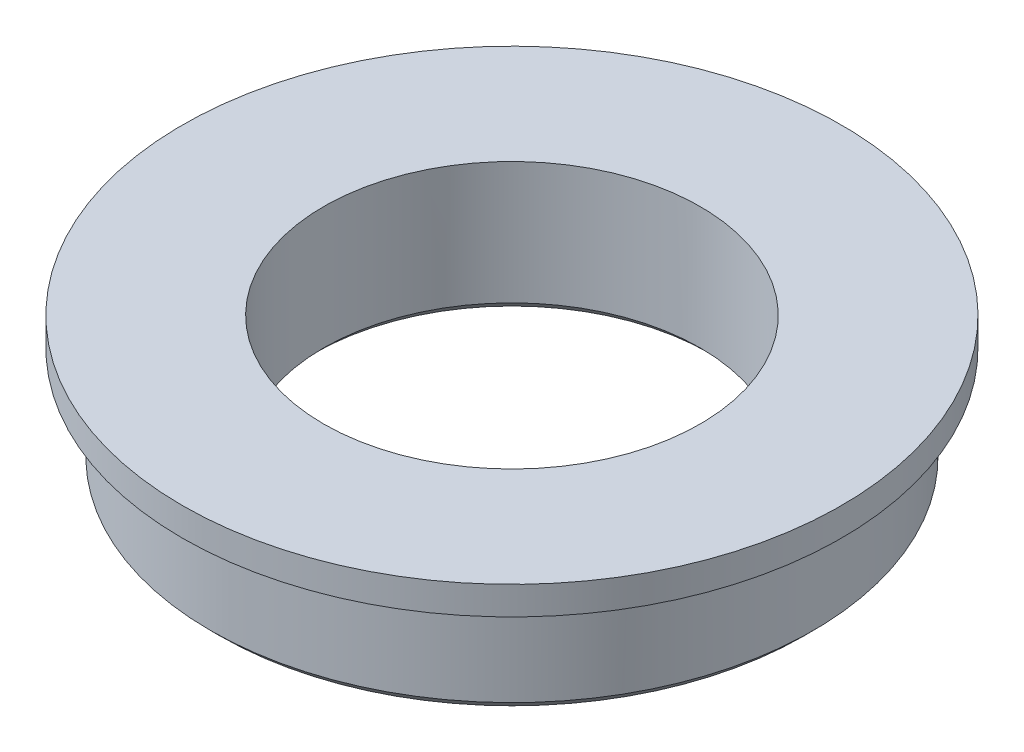
ISO-10303-21;
HEADER;
FILE_DESCRIPTION(('STEP AP214'),'2;1');
FILE_NAME('part.step','',(''),(''),'','','');
FILE_SCHEMA(('AUTOMOTIVE_DESIGN { 1 0 10303 214 1 1 1 1 }'));
ENDSEC;
DATA;
#1=APPLICATION_CONTEXT('core data for automotive mechanical design processes');
#2=APPLICATION_PROTOCOL_DEFINITION('international standard','automotive_design',2000,#1);
#3=PRODUCT_CONTEXT('',#1,'mechanical');
#4=PRODUCT('Part','Part','',(#3));
#5=PRODUCT_RELATED_PRODUCT_CATEGORY('part','',(#4));
#6=PRODUCT_DEFINITION_FORMATION('','',#4);
#7=PRODUCT_DEFINITION_CONTEXT('part definition',#1,'design');
#8=PRODUCT_DEFINITION('design','',#6,#7);
#9=PRODUCT_DEFINITION_SHAPE('','',#8);
#10=(LENGTH_UNIT() NAMED_UNIT(*) SI_UNIT(.MILLI.,.METRE.));
#11=(NAMED_UNIT(*) PLANE_ANGLE_UNIT() SI_UNIT($,.RADIAN.));
#12=(NAMED_UNIT(*) SI_UNIT($,.STERADIAN.) SOLID_ANGLE_UNIT());
#13=UNCERTAINTY_MEASURE_WITH_UNIT(LENGTH_MEASURE(1.E-05),#10,'distance_accuracy_value','');
#14=(GEOMETRIC_REPRESENTATION_CONTEXT(3) GLOBAL_UNCERTAINTY_ASSIGNED_CONTEXT((#13)) GLOBAL_UNIT_ASSIGNED_CONTEXT((#10,
#11,#12)) REPRESENTATION_CONTEXT('',''));
#15=CARTESIAN_POINT('',(0.,0.,0.));
#16=DIRECTION('',(0.,0.,1.));
#17=DIRECTION('',(1.,0.,0.));
#18=AXIS2_PLACEMENT_3D('',#15,#16,#17);
#19=CARTESIAN_POINT('',(-16.,0.,0.));
#20=DIRECTION('',(0.,-1.,0.));
#21=DIRECTION('',(0.,0.,-1.));
#22=AXIS2_PLACEMENT_3D('',#19,#20,#21);
#23=PLANE('',#22);
#24=CARTESIAN_POINT('',(0.,0.,0.));
#25=DIRECTION('',(0.,-1.,0.));
#26=DIRECTION('',(0.,0.,-1.));
#27=AXIS2_PLACEMENT_3D('',#24,#25,#26);
#28=CIRCLE('',#27,10.5);
#29=CARTESIAN_POINT('',(0.,0.,-10.5));
#30=VERTEX_POINT('',#29);
#31=EDGE_CURVE('E44',#30,#30,#28,.F.);
#32=ORIENTED_EDGE('',*,*,#31,.T.);
#33=EDGE_LOOP('',(#32));
#34=FACE_BOUND('',#33,.T.);
#35=CARTESIAN_POINT('',(0.,0.,0.));
#36=DIRECTION('',(0.,-1.,0.));
#37=DIRECTION('',(0.,0.,-1.));
#38=AXIS2_PLACEMENT_3D('',#35,#36,#37);
#39=CIRCLE('',#38,15.5);
#40=CARTESIAN_POINT('',(0.,0.,-15.5));
#41=VERTEX_POINT('',#40);
#42=EDGE_CURVE('E48',#41,#41,#39,.T.);
#43=ORIENTED_EDGE('',*,*,#42,.T.);
#44=EDGE_LOOP('',(#43));
#45=FACE_BOUND('',#44,.T.);
#46=ADVANCED_FACE('F33',(#34,#45),#23,.T.);
#47=CARTESIAN_POINT('',(0.,90.7071628576238,0.));
#48=DIRECTION('',(0.,1.,0.));
#49=DIRECTION('',(0.,0.,1.));
#50=AXIS2_PLACEMENT_3D('',#47,#48,#49);
#51=CYLINDRICAL_SURFACE('',#50,9.99999999999999);
#52=CARTESIAN_POINT('',(0.,0.500000000000014,0.));
#53=DIRECTION('',(0.,-1.,0.));
#54=DIRECTION('',(0.,0.,-1.));
#55=AXIS2_PLACEMENT_3D('',#52,#53,#54);
#56=CIRCLE('',#55,9.99999999999999);
#57=CARTESIAN_POINT('',(0.,0.500000000000014,-9.99999999999999));
#58=VERTEX_POINT('',#57);
#59=EDGE_CURVE('E40',#58,#58,#56,.T.);
#60=ORIENTED_EDGE('',*,*,#59,.T.);
#61=EDGE_LOOP('',(#60));
#62=FACE_BOUND('',#61,.T.);
#63=CARTESIAN_POINT('',(0.,6.99999999999999,0.));
#64=DIRECTION('',(0.,1.,0.));
#65=DIRECTION('',(0.,0.,1.));
#66=AXIS2_PLACEMENT_3D('',#63,#64,#65);
#67=CIRCLE('',#66,9.99999999999999);
#68=CARTESIAN_POINT('',(0.,6.99999999999999,9.99999999999999));
#69=VERTEX_POINT('',#68);
#70=EDGE_CURVE('E53',#69,#69,#67,.T.);
#71=ORIENTED_EDGE('',*,*,#70,.T.);
#72=EDGE_LOOP('',(#71));
#73=FACE_BOUND('',#72,.T.);
#74=ADVANCED_FACE('F81',(#62,#73),#51,.F.);
#75=CARTESIAN_POINT('',(-9.99999999999999,7.,0.));
#76=DIRECTION('',(0.,1.,0.));
#77=DIRECTION('',(0.,0.,1.));
#78=AXIS2_PLACEMENT_3D('',#75,#76,#77);
#79=PLANE('',#78);
#80=CARTESIAN_POINT('',(0.,6.99999999999999,0.));
#81=DIRECTION('',(0.,1.,0.));
#82=DIRECTION('',(0.,0.,1.));
#83=AXIS2_PLACEMENT_3D('',#80,#81,#82);
#84=CIRCLE('',#83,17.5);
#85=CARTESIAN_POINT('',(0.,6.99999999999999,17.5));
#86=VERTEX_POINT('',#85);
#87=EDGE_CURVE('E56',#86,#86,#84,.T.);
#88=ORIENTED_EDGE('',*,*,#87,.T.);
#89=EDGE_LOOP('',(#88));
#90=FACE_BOUND('',#89,.T.);
#91=ORIENTED_EDGE('',*,*,#70,.F.);
#92=EDGE_LOOP('',(#91));
#93=FACE_BOUND('',#92,.T.);
#94=ADVANCED_FACE('F87',(#90,#93),#79,.T.);
#95=CARTESIAN_POINT('',(0.,90.7071628576238,0.));
#96=DIRECTION('',(0.,1.,0.));
#97=DIRECTION('',(0.,0.,1.));
#98=AXIS2_PLACEMENT_3D('',#95,#96,#97);
#99=CYLINDRICAL_SURFACE('',#98,17.5);
#100=CARTESIAN_POINT('',(0.,5.50000000000001,0.));
#101=DIRECTION('',(0.,1.,0.));
#102=DIRECTION('',(0.,0.,1.));
#103=AXIS2_PLACEMENT_3D('',#100,#101,#102);
#104=CIRCLE('',#103,17.5);
#105=CARTESIAN_POINT('',(0.,5.50000000000001,17.5));
#106=VERTEX_POINT('',#105);
#107=EDGE_CURVE('E59',#106,#106,#104,.T.);
#108=ORIENTED_EDGE('',*,*,#107,.T.);
#109=EDGE_LOOP('',(#108));
#110=FACE_BOUND('',#109,.T.);
#111=ORIENTED_EDGE('',*,*,#87,.F.);
#112=EDGE_LOOP('',(#111));
#113=FACE_BOUND('',#112,.T.);
#114=ADVANCED_FACE('F78',(#110,#113),#99,.T.);
#115=CARTESIAN_POINT('',(-17.5,5.5,0.));
#116=DIRECTION('',(0.,-1.,0.));
#117=DIRECTION('',(0.,0.,-1.));
#118=AXIS2_PLACEMENT_3D('',#115,#116,#117);
#119=PLANE('',#118);
#120=CARTESIAN_POINT('',(0.,5.50000000000001,0.));
#121=DIRECTION('',(0.,1.,0.));
#122=DIRECTION('',(0.,0.,1.));
#123=AXIS2_PLACEMENT_3D('',#120,#121,#122);
#124=CIRCLE('',#123,16.);
#125=CARTESIAN_POINT('',(0.,5.50000000000001,16.));
#126=VERTEX_POINT('',#125);
#127=EDGE_CURVE('E62',#126,#126,#124,.T.);
#128=ORIENTED_EDGE('',*,*,#127,.T.);
#129=EDGE_LOOP('',(#128));
#130=FACE_BOUND('',#129,.T.);
#131=ORIENTED_EDGE('',*,*,#107,.F.);
#132=EDGE_LOOP('',(#131));
#133=FACE_BOUND('',#132,.T.);
#134=ADVANCED_FACE('F66',(#130,#133),#119,.T.);
#135=CARTESIAN_POINT('',(0.,90.7071628576238,0.));
#136=DIRECTION('',(0.,1.,0.));
#137=DIRECTION('',(0.,0.,1.));
#138=AXIS2_PLACEMENT_3D('',#135,#136,#137);
#139=CYLINDRICAL_SURFACE('',#138,16.);
#140=CARTESIAN_POINT('',(0.,0.500000000000014,0.));
#141=DIRECTION('',(0.,-1.,0.));
#142=DIRECTION('',(0.,0.,-1.));
#143=AXIS2_PLACEMENT_3D('',#140,#141,#142);
#144=CIRCLE('',#143,16.);
#145=CARTESIAN_POINT('',(0.,0.500000000000014,-16.));
#146=VERTEX_POINT('',#145);
#147=EDGE_CURVE('E10',#146,#146,#144,.F.);
#148=ORIENTED_EDGE('',*,*,#147,.T.);
#149=EDGE_LOOP('',(#148));
#150=FACE_BOUND('',#149,.T.);
#151=ORIENTED_EDGE('',*,*,#127,.F.);
#152=EDGE_LOOP('',(#151));
#153=FACE_BOUND('',#152,.T.);
#154=ADVANCED_FACE('F69',(#150,#153),#139,.T.);
#155=CARTESIAN_POINT('',(0.,0.,0.));
#156=DIRECTION('',(0.,-1.,0.));
#157=DIRECTION('',(0.,0.,-1.));
#158=AXIS2_PLACEMENT_3D('',#155,#156,#157);
#159=CONICAL_SURFACE('',#158,10.5,0.785398163397445);
#160=ORIENTED_EDGE('',*,*,#59,.F.);
#161=EDGE_LOOP('',(#160));
#162=FACE_BOUND('',#161,.T.);
#163=ORIENTED_EDGE('',*,*,#31,.F.);
#164=EDGE_LOOP('',(#163));
#165=FACE_BOUND('',#164,.T.);
#166=ADVANCED_FACE('F71',(#162,#165),#159,.F.);
#167=CARTESIAN_POINT('',(0.,0.500000000000014,0.));
#168=DIRECTION('',(0.,1.,0.));
#169=DIRECTION('',(0.,0.,1.));
#170=AXIS2_PLACEMENT_3D('',#167,#168,#169);
#171=CONICAL_SURFACE('',#170,16.,0.785398163397448);
#172=ORIENTED_EDGE('',*,*,#42,.F.);
#173=EDGE_LOOP('',(#172));
#174=FACE_BOUND('',#173,.T.);
#175=ORIENTED_EDGE('',*,*,#147,.F.);
#176=EDGE_LOOP('',(#175));
#177=FACE_BOUND('',#176,.T.);
#178=ADVANCED_FACE('F35',(#174,#177),#171,.T.);
#179=CLOSED_SHELL('',(#46,#74,#94,#114,#134,#154,#166,#178));
#180=MANIFOLD_SOLID_BREP('B2',#179);
#181=ADVANCED_BREP_SHAPE_REPRESENTATION('',(#18,#180),#14);
#182=SHAPE_DEFINITION_REPRESENTATION(#9,#181);
ENDSEC;
END-ISO-10303-21;
